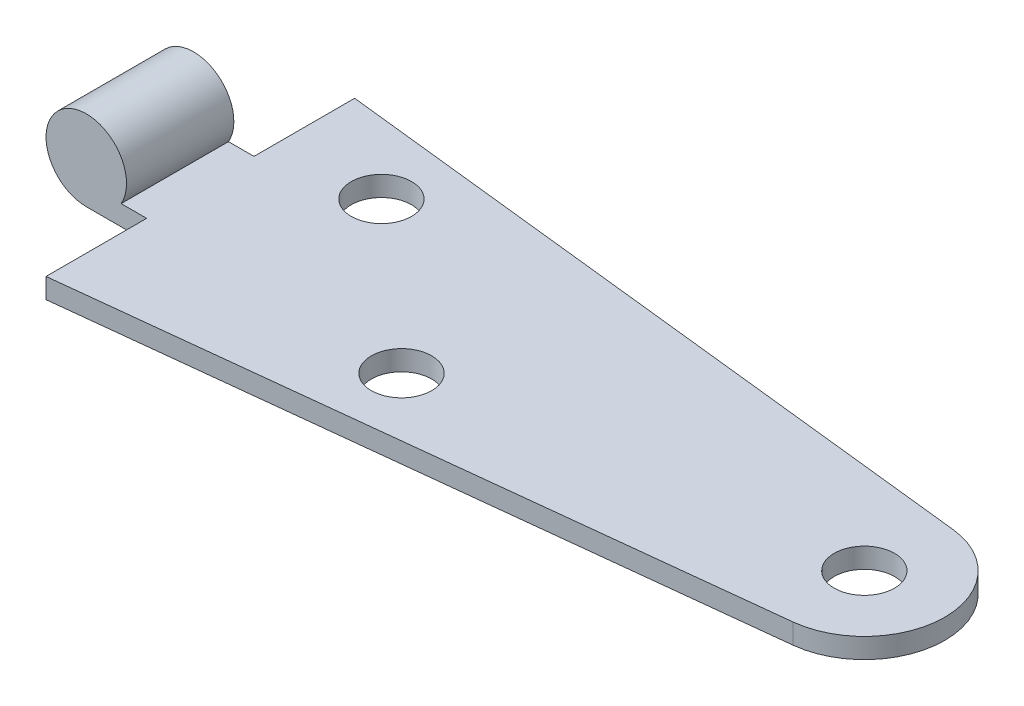
ISO-10303-21;
HEADER;
FILE_DESCRIPTION(('STEP AP214'),'2;1');
FILE_NAME('part.step','',(''),(''),'','','');
FILE_SCHEMA(('AUTOMOTIVE_DESIGN { 1 0 10303 214 1 1 1 1 }'));
ENDSEC;
DATA;
#1=APPLICATION_CONTEXT('core data for automotive mechanical design processes');
#2=APPLICATION_PROTOCOL_DEFINITION('international standard','automotive_design',2000,#1);
#3=PRODUCT_CONTEXT('',#1,'mechanical');
#4=PRODUCT('Part','Part','',(#3));
#5=PRODUCT_RELATED_PRODUCT_CATEGORY('part','',(#4));
#6=PRODUCT_DEFINITION_FORMATION('','',#4);
#7=PRODUCT_DEFINITION_CONTEXT('part definition',#1,'design');
#8=PRODUCT_DEFINITION('design','',#6,#7);
#9=PRODUCT_DEFINITION_SHAPE('','',#8);
#10=(LENGTH_UNIT() NAMED_UNIT(*) SI_UNIT(.MILLI.,.METRE.));
#11=(NAMED_UNIT(*) PLANE_ANGLE_UNIT() SI_UNIT($,.RADIAN.));
#12=(NAMED_UNIT(*) SI_UNIT($,.STERADIAN.) SOLID_ANGLE_UNIT());
#13=UNCERTAINTY_MEASURE_WITH_UNIT(LENGTH_MEASURE(1.E-05),#10,'distance_accuracy_value','');
#14=(GEOMETRIC_REPRESENTATION_CONTEXT(3) GLOBAL_UNCERTAINTY_ASSIGNED_CONTEXT((#13)) GLOBAL_UNIT_ASSIGNED_CONTEXT((#10,
#11,#12)) REPRESENTATION_CONTEXT('',''));
#15=CARTESIAN_POINT('',(0.,0.,0.));
#16=DIRECTION('',(0.,0.,1.));
#17=DIRECTION('',(1.,0.,0.));
#18=AXIS2_PLACEMENT_3D('',#15,#16,#17);
#19=CARTESIAN_POINT('',(0.,1.5875,0.));
#20=DIRECTION('',(0.,1.,0.));
#21=DIRECTION('',(0.,0.,1.));
#22=AXIS2_PLACEMENT_3D('',#19,#20,#21);
#23=PLANE('',#22);
#24=DIRECTION('',(-1.,0.,0.));
#25=VECTOR('',#24,1.);
#26=CARTESIAN_POINT('',(0.,1.5875,4.23333333333332));
#27=LINE('',#26,#25);
#28=CARTESIAN_POINT('',(-52.3875,1.5875,4.23333333333333));
#29=VERTEX_POINT('',#28);
#30=CARTESIAN_POINT('',(-54.4003693429844,1.5875,4.23333333333333));
#31=VERTEX_POINT('',#30);
#32=EDGE_CURVE('E116',#29,#31,#27,.T.);
#33=ORIENTED_EDGE('',*,*,#32,.F.);
#34=DIRECTION('',(0.,0.,-1.));
#35=VECTOR('',#34,1.);
#36=CARTESIAN_POINT('',(-52.3875,1.5875,0.));
#37=LINE('',#36,#35);
#38=CARTESIAN_POINT('',(-52.3875,1.5875,12.1740504186807));
#39=VERTEX_POINT('',#38);
#40=EDGE_CURVE('E112',#39,#29,#37,.T.);
#41=ORIENTED_EDGE('',*,*,#40,.F.);
#42=DIRECTION('',(0.993957205990649,0.,-0.109768267997922));
#43=VECTOR('',#42,1.);
#44=CARTESIAN_POINT('',(-57.15,1.5875,12.7));
#45=LINE('',#44,#43);
#46=CARTESIAN_POINT('',(0.697028501786803,1.5875,6.31162825804061));
#47=VERTEX_POINT('',#46);
#48=EDGE_CURVE('E166',#39,#47,#45,.T.);
#49=ORIENTED_EDGE('',*,*,#48,.T.);
#50=CARTESIAN_POINT('',(0.,1.5875,0.));
#51=DIRECTION('',(0.,1.,0.));
#52=DIRECTION('',(0.,0.,1.));
#53=AXIS2_PLACEMENT_3D('',#50,#51,#52);
#54=CIRCLE('',#53,6.35);
#55=CARTESIAN_POINT('',(0.697028501786803,1.5875,-6.31162825804062));
#56=VERTEX_POINT('',#55);
#57=EDGE_CURVE('E52',#47,#56,#54,.T.);
#58=ORIENTED_EDGE('',*,*,#57,.T.);
#59=DIRECTION('',(-0.993957205990649,0.,-0.109768267997922));
#60=VECTOR('',#59,1.);
#61=CARTESIAN_POINT('',(-57.15,1.5875,-12.7));
#62=LINE('',#61,#60);
#63=CARTESIAN_POINT('',(-52.3875,1.5875,-12.1740504186807));
#64=VERTEX_POINT('',#63);
#65=EDGE_CURVE('E164',#56,#64,#62,.T.);
#66=ORIENTED_EDGE('',*,*,#65,.T.);
#67=DIRECTION('',(0.,0.,-1.));
#68=VECTOR('',#67,1.);
#69=CARTESIAN_POINT('',(-52.3875,1.5875,0.));
#70=LINE('',#69,#68);
#71=CARTESIAN_POINT('',(-52.3875,1.5875,-4.23333333333333));
#72=VERTEX_POINT('',#71);
#73=EDGE_CURVE('E71',#72,#64,#70,.T.);
#74=ORIENTED_EDGE('',*,*,#73,.F.);
#75=DIRECTION('',(1.,0.,0.));
#76=VECTOR('',#75,1.);
#77=CARTESIAN_POINT('',(0.,1.5875,-4.23333333333334));
#78=LINE('',#77,#76);
#79=CARTESIAN_POINT('',(-54.4003693429844,1.5875,-4.23333333333333));
#80=VERTEX_POINT('',#79);
#81=EDGE_CURVE('E140',#80,#72,#78,.T.);
#82=ORIENTED_EDGE('',*,*,#81,.F.);
#83=DIRECTION('',(0.,0.,-1.));
#84=VECTOR('',#83,1.);
#85=CARTESIAN_POINT('',(-54.4003693429844,1.5875,-12.7));
#86=LINE('',#85,#84);
#87=EDGE_CURVE('E143',#31,#80,#86,.T.);
#88=ORIENTED_EDGE('',*,*,#87,.F.);
#89=EDGE_LOOP('',(#33,#41,#49,#58,#66,#74,#82,#88));
#90=FACE_BOUND('',#89,.T.);
#91=CARTESIAN_POINT('',(-44.45,1.5875,-6.35));
#92=DIRECTION('',(0.,1.,0.));
#93=DIRECTION('',(0.,0.,1.));
#94=AXIS2_PLACEMENT_3D('',#91,#92,#93);
#95=CIRCLE('',#94,2.38125);
#96=CARTESIAN_POINT('',(-44.45,1.5875,-3.96875));
#97=VERTEX_POINT('',#96);
#98=EDGE_CURVE('E152',#97,#97,#95,.T.);
#99=ORIENTED_EDGE('',*,*,#98,.F.);
#100=EDGE_LOOP('',(#99));
#101=FACE_BOUND('',#100,.T.);
#102=CARTESIAN_POINT('',(0.,1.5875,0.));
#103=DIRECTION('',(0.,1.,0.));
#104=DIRECTION('',(0.,0.,1.));
#105=AXIS2_PLACEMENT_3D('',#102,#103,#104);
#106=CIRCLE('',#105,2.38125);
#107=CARTESIAN_POINT('',(0.,1.5875,2.38125));
#108=VERTEX_POINT('',#107);
#109=EDGE_CURVE('E158',#108,#108,#106,.T.);
#110=ORIENTED_EDGE('',*,*,#109,.F.);
#111=EDGE_LOOP('',(#110));
#112=FACE_BOUND('',#111,.T.);
#113=CARTESIAN_POINT('',(-31.75,1.5875,4.7625));
#114=DIRECTION('',(0.,1.,0.));
#115=DIRECTION('',(0.,0.,1.));
#116=AXIS2_PLACEMENT_3D('',#113,#114,#115);
#117=CIRCLE('',#116,2.38125);
#118=CARTESIAN_POINT('',(-31.75,1.5875,7.14375));
#119=VERTEX_POINT('',#118);
#120=EDGE_CURVE('E146',#119,#119,#117,.T.);
#121=ORIENTED_EDGE('',*,*,#120,.F.);
#122=EDGE_LOOP('',(#121));
#123=FACE_BOUND('',#122,.T.);
#124=ADVANCED_FACE('F35',(#90,#101,#112,#123),#23,.T.);
#125=CARTESIAN_POINT('',(0.,0.,0.));
#126=DIRECTION('',(0.,1.,0.));
#127=DIRECTION('',(0.,0.,1.));
#128=AXIS2_PLACEMENT_3D('',#125,#126,#127);
#129=PLANE('',#128);
#130=CARTESIAN_POINT('',(-44.45,0.,-6.35));
#131=DIRECTION('',(0.,1.,0.));
#132=DIRECTION('',(0.,0.,1.));
#133=AXIS2_PLACEMENT_3D('',#130,#131,#132);
#134=CIRCLE('',#133,2.38125);
#135=CARTESIAN_POINT('',(-44.45,0.,-3.96875));
#136=VERTEX_POINT('',#135);
#137=EDGE_CURVE('E149',#136,#136,#134,.T.);
#138=ORIENTED_EDGE('',*,*,#137,.T.);
#139=EDGE_LOOP('',(#138));
#140=FACE_BOUND('',#139,.T.);
#141=DIRECTION('',(0.,0.,-1.));
#142=VECTOR('',#141,1.);
#143=CARTESIAN_POINT('',(-52.3875,0.,4.23333333333333));
#144=LINE('',#143,#142);
#145=CARTESIAN_POINT('',(-52.3875,0.,12.1740504186807));
#146=VERTEX_POINT('',#145);
#147=CARTESIAN_POINT('',(-52.3875,0.,4.23333333333333));
#148=VERTEX_POINT('',#147);
#149=EDGE_CURVE('E110',#146,#148,#144,.T.);
#150=ORIENTED_EDGE('',*,*,#149,.T.);
#151=DIRECTION('',(-1.,0.,0.));
#152=VECTOR('',#151,1.);
#153=CARTESIAN_POINT('',(-52.3875,0.,4.23333333333333));
#154=LINE('',#153,#152);
#155=CARTESIAN_POINT('',(-57.15,0.,4.23333333333333));
#156=VERTEX_POINT('',#155);
#157=EDGE_CURVE('E117',#148,#156,#154,.T.);
#158=ORIENTED_EDGE('',*,*,#157,.T.);
#159=DIRECTION('',(0.,0.,1.));
#160=VECTOR('',#159,1.);
#161=CARTESIAN_POINT('',(-57.15,0.,-12.7));
#162=LINE('',#161,#160);
#163=CARTESIAN_POINT('',(-57.15,0.,-4.23333333333333));
#164=VERTEX_POINT('',#163);
#165=EDGE_CURVE('E173',#164,#156,#162,.T.);
#166=ORIENTED_EDGE('',*,*,#165,.F.);
#167=DIRECTION('',(1.,0.,0.));
#168=VECTOR('',#167,1.);
#169=CARTESIAN_POINT('',(-52.3875,0.,-4.23333333333333));
#170=LINE('',#169,#168);
#171=CARTESIAN_POINT('',(-52.3875,0.,-4.23333333333333));
#172=VERTEX_POINT('',#171);
#173=EDGE_CURVE('E135',#164,#172,#170,.T.);
#174=ORIENTED_EDGE('',*,*,#173,.T.);
#175=DIRECTION('',(0.,0.,-1.));
#176=VECTOR('',#175,1.);
#177=CARTESIAN_POINT('',(-52.3875,0.,-12.7));
#178=LINE('',#177,#176);
#179=CARTESIAN_POINT('',(-52.3875,0.,-12.1740504186807));
#180=VERTEX_POINT('',#179);
#181=EDGE_CURVE('E132',#172,#180,#178,.T.);
#182=ORIENTED_EDGE('',*,*,#181,.T.);
#183=DIRECTION('',(-0.993957205990649,0.,-0.109768267997922));
#184=VECTOR('',#183,1.);
#185=CARTESIAN_POINT('',(-57.15,0.,-12.7));
#186=LINE('',#185,#184);
#187=CARTESIAN_POINT('',(0.697028501786803,0.,-6.31162825804062));
#188=VERTEX_POINT('',#187);
#189=EDGE_CURVE('E161',#188,#180,#186,.T.);
#190=ORIENTED_EDGE('',*,*,#189,.F.);
#191=CARTESIAN_POINT('',(0.,0.,0.));
#192=DIRECTION('',(0.,1.,0.));
#193=DIRECTION('',(0.,0.,1.));
#194=AXIS2_PLACEMENT_3D('',#191,#192,#193);
#195=CIRCLE('',#194,6.35);
#196=CARTESIAN_POINT('',(0.697028501786803,0.,6.31162825804061));
#197=VERTEX_POINT('',#196);
#198=EDGE_CURVE('E167',#197,#188,#195,.T.);
#199=ORIENTED_EDGE('',*,*,#198,.F.);
#200=DIRECTION('',(0.993957205990649,0.,-0.109768267997922));
#201=VECTOR('',#200,1.);
#202=CARTESIAN_POINT('',(-57.15,0.,12.7));
#203=LINE('',#202,#201);
#204=EDGE_CURVE('E62',#146,#197,#203,.T.);
#205=ORIENTED_EDGE('',*,*,#204,.F.);
#206=EDGE_LOOP('',(#150,#158,#166,#174,#182,#190,#199,#205));
#207=FACE_BOUND('',#206,.T.);
#208=CARTESIAN_POINT('',(0.,0.,0.));
#209=DIRECTION('',(0.,1.,0.));
#210=DIRECTION('',(0.,0.,1.));
#211=AXIS2_PLACEMENT_3D('',#208,#209,#210);
#212=CIRCLE('',#211,2.38125);
#213=CARTESIAN_POINT('',(0.,0.,2.38125));
#214=VERTEX_POINT('',#213);
#215=EDGE_CURVE('E155',#214,#214,#212,.T.);
#216=ORIENTED_EDGE('',*,*,#215,.T.);
#217=EDGE_LOOP('',(#216));
#218=FACE_BOUND('',#217,.T.);
#219=CARTESIAN_POINT('',(-31.75,0.,4.7625));
#220=DIRECTION('',(0.,1.,0.));
#221=DIRECTION('',(0.,0.,1.));
#222=AXIS2_PLACEMENT_3D('',#219,#220,#221);
#223=CIRCLE('',#222,2.38125);
#224=CARTESIAN_POINT('',(-31.75,0.,7.14375));
#225=VERTEX_POINT('',#224);
#226=EDGE_CURVE('E145',#225,#225,#223,.T.);
#227=ORIENTED_EDGE('',*,*,#226,.T.);
#228=EDGE_LOOP('',(#227));
#229=FACE_BOUND('',#228,.T.);
#230=ADVANCED_FACE('F125',(#140,#207,#218,#229),#129,.F.);
#231=CARTESIAN_POINT('',(-57.15,1.5875,-12.7));
#232=DIRECTION('',(-0.109768267997922,0.,0.993957205990649));
#233=DIRECTION('',(0.993957205990649,0.,0.109768267997922));
#234=AXIS2_PLACEMENT_3D('',#231,#232,#233);
#235=PLANE('',#234);
#236=ORIENTED_EDGE('',*,*,#189,.T.);
#237=DIRECTION('',(0.,1.,0.));
#238=VECTOR('',#237,1.);
#239=CARTESIAN_POINT('',(-52.3875,1.5875,-12.1740504186807));
#240=LINE('',#239,#238);
#241=EDGE_CURVE('E184',#180,#64,#240,.T.);
#242=ORIENTED_EDGE('',*,*,#241,.T.);
#243=ORIENTED_EDGE('',*,*,#65,.F.);
#244=DIRECTION('',(0.,-1.,0.));
#245=VECTOR('',#244,1.);
#246=CARTESIAN_POINT('',(0.697028501786803,1.5875,-6.31162825804062));
#247=LINE('',#246,#245);
#248=EDGE_CURVE('E170',#56,#188,#247,.T.);
#249=ORIENTED_EDGE('',*,*,#248,.T.);
#250=EDGE_LOOP('',(#236,#242,#243,#249));
#251=FACE_BOUND('',#250,.T.);
#252=ADVANCED_FACE('F37',(#251),#235,.F.);
#253=CARTESIAN_POINT('',(-57.15,1.5875,12.7));
#254=DIRECTION('',(-0.109768267997922,0.,-0.993957205990649));
#255=DIRECTION('',(-0.993957205990649,0.,0.109768267997922));
#256=AXIS2_PLACEMENT_3D('',#253,#254,#255);
#257=PLANE('',#256);
#258=ORIENTED_EDGE('',*,*,#48,.F.);
#259=DIRECTION('',(0.,-1.,0.));
#260=VECTOR('',#259,1.);
#261=CARTESIAN_POINT('',(-52.3875,1.5875,12.1740504186807));
#262=LINE('',#261,#260);
#263=EDGE_CURVE('E11',#39,#146,#262,.T.);
#264=ORIENTED_EDGE('',*,*,#263,.T.);
#265=ORIENTED_EDGE('',*,*,#204,.T.);
#266=DIRECTION('',(0.,-1.,0.));
#267=VECTOR('',#266,1.);
#268=CARTESIAN_POINT('',(0.697028501786803,1.5875,6.31162825804061));
#269=LINE('',#268,#267);
#270=EDGE_CURVE('E179',#47,#197,#269,.T.);
#271=ORIENTED_EDGE('',*,*,#270,.F.);
#272=EDGE_LOOP('',(#258,#264,#265,#271));
#273=FACE_BOUND('',#272,.T.);
#274=ADVANCED_FACE('F199',(#273),#257,.F.);
#275=CARTESIAN_POINT('',(0.,1.5875,0.));
#276=DIRECTION('',(0.,-1.,0.));
#277=DIRECTION('',(0.,0.,-1.));
#278=AXIS2_PLACEMENT_3D('',#275,#276,#277);
#279=CYLINDRICAL_SURFACE('',#278,6.35);
#280=ORIENTED_EDGE('',*,*,#198,.T.);
#281=ORIENTED_EDGE('',*,*,#248,.F.);
#282=ORIENTED_EDGE('',*,*,#57,.F.);
#283=ORIENTED_EDGE('',*,*,#270,.T.);
#284=EDGE_LOOP('',(#280,#281,#282,#283));
#285=FACE_BOUND('',#284,.T.);
#286=ADVANCED_FACE('F201',(#285),#279,.T.);
#287=CARTESIAN_POINT('',(0.,1.5875,0.));
#288=DIRECTION('',(0.,-1.,0.));
#289=DIRECTION('',(0.,0.,-1.));
#290=AXIS2_PLACEMENT_3D('',#287,#288,#289);
#291=CYLINDRICAL_SURFACE('',#290,2.38125);
#292=ORIENTED_EDGE('',*,*,#109,.T.);
#293=EDGE_LOOP('',(#292));
#294=FACE_BOUND('',#293,.T.);
#295=ORIENTED_EDGE('',*,*,#215,.F.);
#296=EDGE_LOOP('',(#295));
#297=FACE_BOUND('',#296,.T.);
#298=ADVANCED_FACE('F203',(#294,#297),#291,.F.);
#299=CARTESIAN_POINT('',(-44.45,1.5875,-6.35));
#300=DIRECTION('',(0.,-1.,0.));
#301=DIRECTION('',(0.,0.,-1.));
#302=AXIS2_PLACEMENT_3D('',#299,#300,#301);
#303=CYLINDRICAL_SURFACE('',#302,2.38125);
#304=ORIENTED_EDGE('',*,*,#98,.T.);
#305=EDGE_LOOP('',(#304));
#306=FACE_BOUND('',#305,.T.);
#307=ORIENTED_EDGE('',*,*,#137,.F.);
#308=EDGE_LOOP('',(#307));
#309=FACE_BOUND('',#308,.T.);
#310=ADVANCED_FACE('F209',(#306,#309),#303,.F.);
#311=CARTESIAN_POINT('',(-31.75,1.5875,4.7625));
#312=DIRECTION('',(0.,-1.,0.));
#313=DIRECTION('',(0.,0.,-1.));
#314=AXIS2_PLACEMENT_3D('',#311,#312,#313);
#315=CYLINDRICAL_SURFACE('',#314,2.38125);
#316=ORIENTED_EDGE('',*,*,#120,.T.);
#317=EDGE_LOOP('',(#316));
#318=FACE_BOUND('',#317,.T.);
#319=ORIENTED_EDGE('',*,*,#226,.F.);
#320=EDGE_LOOP('',(#319));
#321=FACE_BOUND('',#320,.T.);
#322=ADVANCED_FACE('F222',(#318,#321),#315,.F.);
#323=CARTESIAN_POINT('',(-57.15,3.175,-12.7));
#324=DIRECTION('',(0.,0.,-1.));
#325=DIRECTION('',(-1.,0.,0.));
#326=AXIS2_PLACEMENT_3D('',#323,#324,#325);
#327=CYLINDRICAL_SURFACE('',#326,3.175);
#328=CARTESIAN_POINT('',(-57.15,3.175,4.23333333333333));
#329=DIRECTION('',(0.,0.,-1.));
#330=DIRECTION('',(-1.,0.,0.));
#331=AXIS2_PLACEMENT_3D('',#328,#329,#330);
#332=CIRCLE('',#331,3.175);
#333=EDGE_CURVE('E44',#31,#156,#332,.F.);
#334=ORIENTED_EDGE('',*,*,#333,.F.);
#335=ORIENTED_EDGE('',*,*,#87,.T.);
#336=CARTESIAN_POINT('',(-57.15,3.175,-4.23333333333333));
#337=DIRECTION('',(0.,0.,1.));
#338=DIRECTION('',(1.,0.,0.));
#339=AXIS2_PLACEMENT_3D('',#336,#337,#338);
#340=CIRCLE('',#339,3.175);
#341=EDGE_CURVE('E181',#164,#80,#340,.F.);
#342=ORIENTED_EDGE('',*,*,#341,.F.);
#343=ORIENTED_EDGE('',*,*,#165,.T.);
#344=EDGE_LOOP('',(#334,#335,#342,#343));
#345=FACE_BOUND('',#344,.T.);
#346=ADVANCED_FACE('F197',(#345),#327,.T.);
#347=CARTESIAN_POINT('',(-52.3875,0.,-12.7));
#348=DIRECTION('',(1.,0.,0.));
#349=DIRECTION('',(0.,0.,-1.));
#350=AXIS2_PLACEMENT_3D('',#347,#348,#349);
#351=PLANE('',#350);
#352=ORIENTED_EDGE('',*,*,#73,.T.);
#353=ORIENTED_EDGE('',*,*,#241,.F.);
#354=ORIENTED_EDGE('',*,*,#181,.F.);
#355=DIRECTION('',(0.,1.,0.));
#356=VECTOR('',#355,1.);
#357=CARTESIAN_POINT('',(-52.3875,0.,-4.23333333333333));
#358=LINE('',#357,#356);
#359=EDGE_CURVE('E138',#172,#72,#358,.T.);
#360=ORIENTED_EDGE('',*,*,#359,.T.);
#361=EDGE_LOOP('',(#352,#353,#354,#360));
#362=FACE_BOUND('',#361,.T.);
#363=ADVANCED_FACE('F195',(#362),#351,.F.);
#364=CARTESIAN_POINT('',(-52.3875,0.,-4.23333333333333));
#365=DIRECTION('',(0.,0.,1.));
#366=DIRECTION('',(1.,0.,0.));
#367=AXIS2_PLACEMENT_3D('',#364,#365,#366);
#368=PLANE('',#367);
#369=ORIENTED_EDGE('',*,*,#81,.T.);
#370=ORIENTED_EDGE('',*,*,#359,.F.);
#371=ORIENTED_EDGE('',*,*,#173,.F.);
#372=ORIENTED_EDGE('',*,*,#341,.T.);
#373=EDGE_LOOP('',(#369,#370,#371,#372));
#374=FACE_BOUND('',#373,.T.);
#375=ADVANCED_FACE('F193',(#374),#368,.F.);
#376=CARTESIAN_POINT('',(-52.3875,0.,4.23333333333333));
#377=DIRECTION('',(0.,0.,-1.));
#378=DIRECTION('',(-1.,0.,0.));
#379=AXIS2_PLACEMENT_3D('',#376,#377,#378);
#380=PLANE('',#379);
#381=ORIENTED_EDGE('',*,*,#32,.T.);
#382=ORIENTED_EDGE('',*,*,#333,.T.);
#383=ORIENTED_EDGE('',*,*,#157,.F.);
#384=DIRECTION('',(0.,1.,0.));
#385=VECTOR('',#384,1.);
#386=CARTESIAN_POINT('',(-52.3875,0.,4.23333333333333));
#387=LINE('',#386,#385);
#388=EDGE_CURVE('E106',#148,#29,#387,.T.);
#389=ORIENTED_EDGE('',*,*,#388,.T.);
#390=EDGE_LOOP('',(#381,#382,#383,#389));
#391=FACE_BOUND('',#390,.T.);
#392=ADVANCED_FACE('F120',(#391),#380,.F.);
#393=CARTESIAN_POINT('',(-52.3875,0.,4.23333333333333));
#394=DIRECTION('',(1.,0.,0.));
#395=DIRECTION('',(0.,0.,-1.));
#396=AXIS2_PLACEMENT_3D('',#393,#394,#395);
#397=PLANE('',#396);
#398=ORIENTED_EDGE('',*,*,#40,.T.);
#399=ORIENTED_EDGE('',*,*,#388,.F.);
#400=ORIENTED_EDGE('',*,*,#149,.F.);
#401=ORIENTED_EDGE('',*,*,#263,.F.);
#402=EDGE_LOOP('',(#398,#399,#400,#401));
#403=FACE_BOUND('',#402,.T.);
#404=ADVANCED_FACE('F108',(#403),#397,.F.);
#405=CLOSED_SHELL('',(#124,#230,#252,#274,#286,#298,#310,#322,#346,#363,#375,#392,#404));
#406=MANIFOLD_SOLID_BREP('B2',#405);
#407=ADVANCED_BREP_SHAPE_REPRESENTATION('',(#18,#406),#14);
#408=SHAPE_DEFINITION_REPRESENTATION(#9,#407);
ENDSEC;
END-ISO-10303-21;
